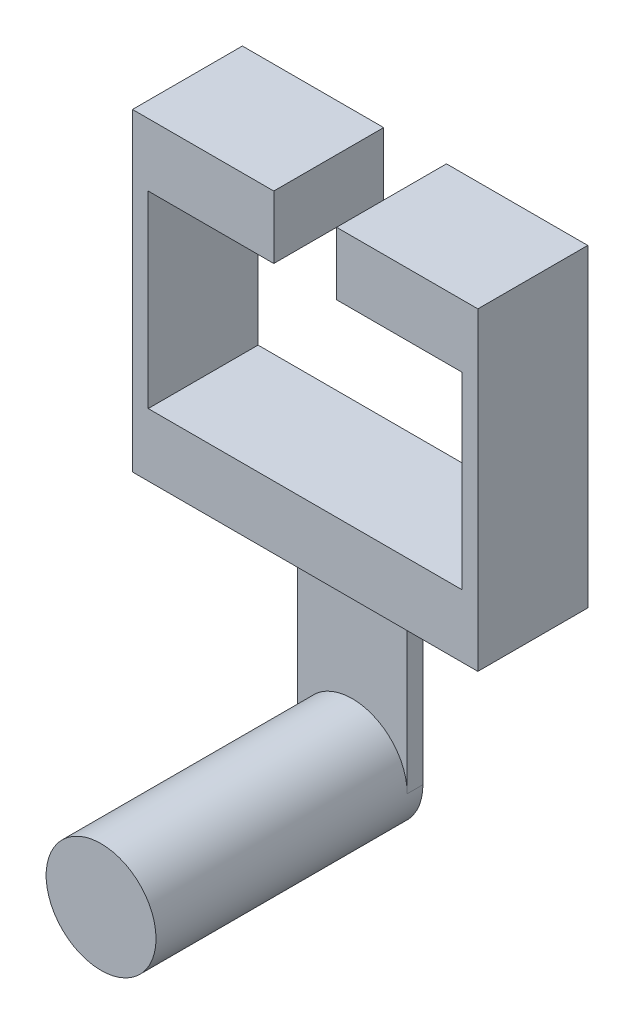
ISO-10303-21;
HEADER;
FILE_DESCRIPTION(('STEP AP214'),'2;1');
FILE_NAME('part.step','',(''),(''),'','','');
FILE_SCHEMA(('AUTOMOTIVE_DESIGN { 1 0 10303 214 1 1 1 1 }'));
ENDSEC;
DATA;
#1=APPLICATION_CONTEXT('core data for automotive mechanical design processes');
#2=APPLICATION_PROTOCOL_DEFINITION('international standard','automotive_design',2000,#1);
#3=PRODUCT_CONTEXT('',#1,'mechanical');
#4=PRODUCT('Part','Part','',(#3));
#5=PRODUCT_RELATED_PRODUCT_CATEGORY('part','',(#4));
#6=PRODUCT_DEFINITION_FORMATION('','',#4);
#7=PRODUCT_DEFINITION_CONTEXT('part definition',#1,'design');
#8=PRODUCT_DEFINITION('design','',#6,#7);
#9=PRODUCT_DEFINITION_SHAPE('','',#8);
#10=(LENGTH_UNIT() NAMED_UNIT(*) SI_UNIT(.MILLI.,.METRE.));
#11=(NAMED_UNIT(*) PLANE_ANGLE_UNIT() SI_UNIT($,.RADIAN.));
#12=(NAMED_UNIT(*) SI_UNIT($,.STERADIAN.) SOLID_ANGLE_UNIT());
#13=UNCERTAINTY_MEASURE_WITH_UNIT(LENGTH_MEASURE(1.E-05),#10,'distance_accuracy_value','');
#14=(GEOMETRIC_REPRESENTATION_CONTEXT(3) GLOBAL_UNCERTAINTY_ASSIGNED_CONTEXT((#13)) GLOBAL_UNIT_ASSIGNED_CONTEXT((#10,
#11,#12)) REPRESENTATION_CONTEXT('',''));
#15=CARTESIAN_POINT('',(0.,0.,0.));
#16=DIRECTION('',(0.,0.,1.));
#17=DIRECTION('',(1.,0.,0.));
#18=AXIS2_PLACEMENT_3D('',#15,#16,#17);
#19=CARTESIAN_POINT('',(171.905082289812,256.485559068862,875.));
#20=DIRECTION('',(0.,1.,0.));
#21=DIRECTION('',(0.,0.,1.));
#22=AXIS2_PLACEMENT_3D('',#19,#20,#21);
#23=PLANE('',#22);
#24=DIRECTION('',(1.,0.,0.));
#25=VECTOR('',#24,1.);
#26=CARTESIAN_POINT('',(171.905082289812,256.485559068862,0.));
#27=LINE('',#26,#25);
#28=CARTESIAN_POINT('',(171.905082289812,256.485559068862,0.));
#29=VERTEX_POINT('',#28);
#30=CARTESIAN_POINT('',(2921.90508228981,256.485559068862,0.));
#31=VERTEX_POINT('',#30);
#32=EDGE_CURVE('E172',#29,#31,#27,.T.);
#33=ORIENTED_EDGE('',*,*,#32,.T.);
#34=DIRECTION('',(0.,0.,-1.));
#35=VECTOR('',#34,1.);
#36=CARTESIAN_POINT('',(2921.90508228981,256.485559068862,875.));
#37=LINE('',#36,#35);
#38=CARTESIAN_POINT('',(2921.90508228981,256.485559068862,875.));
#39=VERTEX_POINT('',#38);
#40=EDGE_CURVE('E11',#39,#31,#37,.T.);
#41=ORIENTED_EDGE('',*,*,#40,.F.);
#42=DIRECTION('',(1.,0.,0.));
#43=VECTOR('',#42,1.);
#44=CARTESIAN_POINT('',(171.905082289812,256.485559068862,875.));
#45=LINE('',#44,#43);
#46=CARTESIAN_POINT('',(171.905082289812,256.485559068862,875.));
#47=VERTEX_POINT('',#46);
#48=EDGE_CURVE('E176',#47,#39,#45,.T.);
#49=ORIENTED_EDGE('',*,*,#48,.F.);
#50=DIRECTION('',(0.,0.,-1.));
#51=VECTOR('',#50,1.);
#52=CARTESIAN_POINT('',(171.905082289812,256.485559068862,875.));
#53=LINE('',#52,#51);
#54=EDGE_CURVE('E206',#47,#29,#53,.T.);
#55=ORIENTED_EDGE('',*,*,#54,.T.);
#56=EDGE_LOOP('',(#33,#41,#49,#55));
#57=FACE_BOUND('',#56,.T.);
#58=DIRECTION('',(0.,0.,-1.));
#59=VECTOR('',#58,1.);
#60=CARTESIAN_POINT('',(1109.40508228981,256.485559068862,375.));
#61=LINE('',#60,#59);
#62=CARTESIAN_POINT('',(1109.40508228981,256.485559068862,500.));
#63=VERTEX_POINT('',#62);
#64=CARTESIAN_POINT('',(1109.40508228981,256.485559068862,375.));
#65=VERTEX_POINT('',#64);
#66=EDGE_CURVE('E52',#63,#65,#61,.T.);
#67=ORIENTED_EDGE('',*,*,#66,.F.);
#68=DIRECTION('',(-1.,0.,0.));
#69=VECTOR('',#68,1.);
#70=CARTESIAN_POINT('',(1109.40508228981,256.485559068862,500.));
#71=LINE('',#70,#69);
#72=CARTESIAN_POINT('',(1984.40508228981,256.485559068862,500.));
#73=VERTEX_POINT('',#72);
#74=EDGE_CURVE('E60',#73,#63,#71,.T.);
#75=ORIENTED_EDGE('',*,*,#74,.F.);
#76=DIRECTION('',(0.,0.,1.));
#77=VECTOR('',#76,1.);
#78=CARTESIAN_POINT('',(1984.40508228981,256.485559068862,500.));
#79=LINE('',#78,#77);
#80=CARTESIAN_POINT('',(1984.40508228981,256.485559068862,375.));
#81=VERTEX_POINT('',#80);
#82=EDGE_CURVE('E488',#81,#73,#79,.T.);
#83=ORIENTED_EDGE('',*,*,#82,.F.);
#84=DIRECTION('',(1.,0.,0.));
#85=VECTOR('',#84,1.);
#86=CARTESIAN_POINT('',(1984.40508228981,256.485559068862,375.));
#87=LINE('',#86,#85);
#88=EDGE_CURVE('E481',#65,#81,#87,.T.);
#89=ORIENTED_EDGE('',*,*,#88,.F.);
#90=EDGE_LOOP('',(#67,#75,#83,#89));
#91=FACE_BOUND('',#90,.T.);
#92=ADVANCED_FACE('F39',(#57,#91),#23,.F.);
#93=CARTESIAN_POINT('',(2921.90508228981,256.485559068862,875.));
#94=DIRECTION('',(-1.,0.,0.));
#95=DIRECTION('',(0.,0.,1.));
#96=AXIS2_PLACEMENT_3D('',#93,#94,#95);
#97=PLANE('',#96);
#98=DIRECTION('',(0.,1.,0.));
#99=VECTOR('',#98,1.);
#100=CARTESIAN_POINT('',(2921.90508228981,256.485559068862,0.));
#101=LINE('',#100,#99);
#102=CARTESIAN_POINT('',(2921.90508228981,2756.48555906886,0.));
#103=VERTEX_POINT('',#102);
#104=EDGE_CURVE('E171',#31,#103,#101,.T.);
#105=ORIENTED_EDGE('',*,*,#104,.T.);
#106=DIRECTION('',(0.,0.,-1.));
#107=VECTOR('',#106,1.);
#108=CARTESIAN_POINT('',(2921.90508228981,2756.48555906886,875.));
#109=LINE('',#108,#107);
#110=CARTESIAN_POINT('',(2921.90508228981,2756.48555906886,875.));
#111=VERTEX_POINT('',#110);
#112=EDGE_CURVE('E46',#111,#103,#109,.T.);
#113=ORIENTED_EDGE('',*,*,#112,.F.);
#114=DIRECTION('',(0.,1.,0.));
#115=VECTOR('',#114,1.);
#116=CARTESIAN_POINT('',(2921.90508228981,256.485559068862,875.));
#117=LINE('',#116,#115);
#118=EDGE_CURVE('E181',#39,#111,#117,.T.);
#119=ORIENTED_EDGE('',*,*,#118,.F.);
#120=ORIENTED_EDGE('',*,*,#40,.T.);
#121=EDGE_LOOP('',(#105,#113,#119,#120));
#122=FACE_BOUND('',#121,.T.);
#123=ADVANCED_FACE('F283',(#122),#97,.F.);
#124=CARTESIAN_POINT('',(2921.90508228981,2756.48555906886,875.));
#125=DIRECTION('',(0.,-1.,0.));
#126=DIRECTION('',(0.,0.,-1.));
#127=AXIS2_PLACEMENT_3D('',#124,#125,#126);
#128=PLANE('',#127);
#129=DIRECTION('',(-1.,0.,0.));
#130=VECTOR('',#129,1.);
#131=CARTESIAN_POINT('',(2921.90508228981,2756.48555906886,0.));
#132=LINE('',#131,#130);
#133=CARTESIAN_POINT('',(1796.90508228981,2756.48555906886,0.));
#134=VERTEX_POINT('',#133);
#135=EDGE_CURVE('E207',#103,#134,#132,.T.);
#136=ORIENTED_EDGE('',*,*,#135,.T.);
#137=DIRECTION('',(0.,0.,-1.));
#138=VECTOR('',#137,1.);
#139=CARTESIAN_POINT('',(1796.90508228981,2756.48555906886,875.));
#140=LINE('',#139,#138);
#141=CARTESIAN_POINT('',(1796.90508228981,2756.48555906886,875.));
#142=VERTEX_POINT('',#141);
#143=EDGE_CURVE('E255',#142,#134,#140,.T.);
#144=ORIENTED_EDGE('',*,*,#143,.F.);
#145=DIRECTION('',(-1.,0.,0.));
#146=VECTOR('',#145,1.);
#147=CARTESIAN_POINT('',(2921.90508228981,2756.48555906886,875.));
#148=LINE('',#147,#146);
#149=EDGE_CURVE('E187',#111,#142,#148,.T.);
#150=ORIENTED_EDGE('',*,*,#149,.F.);
#151=ORIENTED_EDGE('',*,*,#112,.T.);
#152=EDGE_LOOP('',(#136,#144,#150,#151));
#153=FACE_BOUND('',#152,.T.);
#154=ADVANCED_FACE('F261',(#153),#128,.F.);
#155=CARTESIAN_POINT('',(1796.90508228981,2756.48555906886,875.));
#156=DIRECTION('',(1.,0.,0.));
#157=DIRECTION('',(0.,0.,-1.));
#158=AXIS2_PLACEMENT_3D('',#155,#156,#157);
#159=PLANE('',#158);
#160=DIRECTION('',(0.,-1.,0.));
#161=VECTOR('',#160,1.);
#162=CARTESIAN_POINT('',(1796.90508228981,2756.48555906886,0.));
#163=LINE('',#162,#161);
#164=CARTESIAN_POINT('',(1796.90508228981,2256.48555906886,0.));
#165=VERTEX_POINT('',#164);
#166=EDGE_CURVE('E211',#134,#165,#163,.T.);
#167=ORIENTED_EDGE('',*,*,#166,.T.);
#168=DIRECTION('',(0.,0.,-1.));
#169=VECTOR('',#168,1.);
#170=CARTESIAN_POINT('',(1796.90508228981,2256.48555906886,875.));
#171=LINE('',#170,#169);
#172=CARTESIAN_POINT('',(1796.90508228981,2256.48555906886,875.));
#173=VERTEX_POINT('',#172);
#174=EDGE_CURVE('E253',#173,#165,#171,.T.);
#175=ORIENTED_EDGE('',*,*,#174,.F.);
#176=DIRECTION('',(0.,-1.,0.));
#177=VECTOR('',#176,1.);
#178=CARTESIAN_POINT('',(1796.90508228981,2756.48555906886,875.));
#179=LINE('',#178,#177);
#180=EDGE_CURVE('E189',#142,#173,#179,.T.);
#181=ORIENTED_EDGE('',*,*,#180,.F.);
#182=ORIENTED_EDGE('',*,*,#143,.T.);
#183=EDGE_LOOP('',(#167,#175,#181,#182));
#184=FACE_BOUND('',#183,.T.);
#185=ADVANCED_FACE('F275',(#184),#159,.F.);
#186=CARTESIAN_POINT('',(1796.90508228981,2256.48555906886,875.));
#187=DIRECTION('',(0.,1.,0.));
#188=DIRECTION('',(0.,0.,1.));
#189=AXIS2_PLACEMENT_3D('',#186,#187,#188);
#190=PLANE('',#189);
#191=DIRECTION('',(1.,0.,0.));
#192=VECTOR('',#191,1.);
#193=CARTESIAN_POINT('',(1796.90508228981,2256.48555906886,0.));
#194=LINE('',#193,#192);
#195=CARTESIAN_POINT('',(2796.90508228981,2256.48555906886,0.));
#196=VERTEX_POINT('',#195);
#197=EDGE_CURVE('E213',#165,#196,#194,.T.);
#198=ORIENTED_EDGE('',*,*,#197,.T.);
#199=DIRECTION('',(0.,0.,-1.));
#200=VECTOR('',#199,1.);
#201=CARTESIAN_POINT('',(2796.90508228981,2256.48555906886,875.));
#202=LINE('',#201,#200);
#203=CARTESIAN_POINT('',(2796.90508228981,2256.48555906886,875.));
#204=VERTEX_POINT('',#203);
#205=EDGE_CURVE('E247',#204,#196,#202,.T.);
#206=ORIENTED_EDGE('',*,*,#205,.F.);
#207=DIRECTION('',(1.,0.,0.));
#208=VECTOR('',#207,1.);
#209=CARTESIAN_POINT('',(1796.90508228981,2256.48555906886,875.));
#210=LINE('',#209,#208);
#211=EDGE_CURVE('E188',#173,#204,#210,.T.);
#212=ORIENTED_EDGE('',*,*,#211,.F.);
#213=ORIENTED_EDGE('',*,*,#174,.T.);
#214=EDGE_LOOP('',(#198,#206,#212,#213));
#215=FACE_BOUND('',#214,.T.);
#216=ADVANCED_FACE('F277',(#215),#190,.F.);
#217=CARTESIAN_POINT('',(2796.90508228981,2256.48555906886,875.));
#218=DIRECTION('',(1.,0.,0.));
#219=DIRECTION('',(0.,0.,-1.));
#220=AXIS2_PLACEMENT_3D('',#217,#218,#219);
#221=PLANE('',#220);
#222=DIRECTION('',(0.,-1.,0.));
#223=VECTOR('',#222,1.);
#224=CARTESIAN_POINT('',(2796.90508228981,2256.48555906886,0.));
#225=LINE('',#224,#223);
#226=CARTESIAN_POINT('',(2796.90508228981,756.485559068861,0.));
#227=VERTEX_POINT('',#226);
#228=EDGE_CURVE('E214',#196,#227,#225,.T.);
#229=ORIENTED_EDGE('',*,*,#228,.T.);
#230=DIRECTION('',(0.,0.,-1.));
#231=VECTOR('',#230,1.);
#232=CARTESIAN_POINT('',(2796.90508228981,756.485559068861,875.));
#233=LINE('',#232,#231);
#234=CARTESIAN_POINT('',(2796.90508228981,756.485559068861,875.));
#235=VERTEX_POINT('',#234);
#236=EDGE_CURVE('E243',#235,#227,#233,.T.);
#237=ORIENTED_EDGE('',*,*,#236,.F.);
#238=DIRECTION('',(0.,-1.,0.));
#239=VECTOR('',#238,1.);
#240=CARTESIAN_POINT('',(2796.90508228981,2256.48555906886,875.));
#241=LINE('',#240,#239);
#242=EDGE_CURVE('E194',#204,#235,#241,.T.);
#243=ORIENTED_EDGE('',*,*,#242,.F.);
#244=ORIENTED_EDGE('',*,*,#205,.T.);
#245=EDGE_LOOP('',(#229,#237,#243,#244));
#246=FACE_BOUND('',#245,.T.);
#247=ADVANCED_FACE('F316',(#246),#221,.F.);
#248=CARTESIAN_POINT('',(2796.90508228981,756.485559068861,875.));
#249=DIRECTION('',(0.,-1.,0.));
#250=DIRECTION('',(1.,0.,0.));
#251=AXIS2_PLACEMENT_3D('',#248,#249,#250);
#252=PLANE('',#251);
#253=DIRECTION('',(-1.,0.,0.));
#254=VECTOR('',#253,1.);
#255=CARTESIAN_POINT('',(2796.90508228981,756.485559068861,0.));
#256=LINE('',#255,#254);
#257=CARTESIAN_POINT('',(296.905082289812,756.485559068861,0.));
#258=VERTEX_POINT('',#257);
#259=EDGE_CURVE('E220',#227,#258,#256,.T.);
#260=ORIENTED_EDGE('',*,*,#259,.T.);
#261=DIRECTION('',(0.,0.,-1.));
#262=VECTOR('',#261,1.);
#263=CARTESIAN_POINT('',(296.905082289812,756.485559068861,875.));
#264=LINE('',#263,#262);
#265=CARTESIAN_POINT('',(296.905082289812,756.485559068861,875.));
#266=VERTEX_POINT('',#265);
#267=EDGE_CURVE('E245',#266,#258,#264,.T.);
#268=ORIENTED_EDGE('',*,*,#267,.F.);
#269=DIRECTION('',(-1.,0.,0.));
#270=VECTOR('',#269,1.);
#271=CARTESIAN_POINT('',(2796.90508228981,756.485559068861,875.));
#272=LINE('',#271,#270);
#273=EDGE_CURVE('E195',#235,#266,#272,.T.);
#274=ORIENTED_EDGE('',*,*,#273,.F.);
#275=ORIENTED_EDGE('',*,*,#236,.T.);
#276=EDGE_LOOP('',(#260,#268,#274,#275));
#277=FACE_BOUND('',#276,.T.);
#278=ADVANCED_FACE('F311',(#277),#252,.F.);
#279=CARTESIAN_POINT('',(296.905082289812,756.485559068861,875.));
#280=DIRECTION('',(-1.,0.,0.));
#281=DIRECTION('',(0.,0.,1.));
#282=AXIS2_PLACEMENT_3D('',#279,#280,#281);
#283=PLANE('',#282);
#284=DIRECTION('',(0.,1.,0.));
#285=VECTOR('',#284,1.);
#286=CARTESIAN_POINT('',(296.905082289812,756.485559068861,0.));
#287=LINE('',#286,#285);
#288=CARTESIAN_POINT('',(296.905082289812,2256.48555906886,0.));
#289=VERTEX_POINT('',#288);
#290=EDGE_CURVE('E218',#258,#289,#287,.T.);
#291=ORIENTED_EDGE('',*,*,#290,.T.);
#292=DIRECTION('',(0.,0.,-1.));
#293=VECTOR('',#292,1.);
#294=CARTESIAN_POINT('',(296.905082289812,2256.48555906886,875.));
#295=LINE('',#294,#293);
#296=CARTESIAN_POINT('',(296.905082289812,2256.48555906886,875.));
#297=VERTEX_POINT('',#296);
#298=EDGE_CURVE('E239',#297,#289,#295,.T.);
#299=ORIENTED_EDGE('',*,*,#298,.F.);
#300=DIRECTION('',(0.,1.,0.));
#301=VECTOR('',#300,1.);
#302=CARTESIAN_POINT('',(296.905082289812,756.485559068861,875.));
#303=LINE('',#302,#301);
#304=EDGE_CURVE('E198',#266,#297,#303,.T.);
#305=ORIENTED_EDGE('',*,*,#304,.F.);
#306=ORIENTED_EDGE('',*,*,#267,.T.);
#307=EDGE_LOOP('',(#291,#299,#305,#306));
#308=FACE_BOUND('',#307,.T.);
#309=ADVANCED_FACE('F310',(#308),#283,.F.);
#310=CARTESIAN_POINT('',(296.905082289812,2256.48555906886,875.));
#311=DIRECTION('',(0.,1.,0.));
#312=DIRECTION('',(0.,0.,1.));
#313=AXIS2_PLACEMENT_3D('',#310,#311,#312);
#314=PLANE('',#313);
#315=DIRECTION('',(1.,0.,0.));
#316=VECTOR('',#315,1.);
#317=CARTESIAN_POINT('',(296.905082289812,2256.48555906886,0.));
#318=LINE('',#317,#316);
#319=CARTESIAN_POINT('',(1296.90508228981,2256.48555906886,0.));
#320=VERTEX_POINT('',#319);
#321=EDGE_CURVE('E222',#289,#320,#318,.T.);
#322=ORIENTED_EDGE('',*,*,#321,.T.);
#323=DIRECTION('',(0.,0.,-1.));
#324=VECTOR('',#323,1.);
#325=CARTESIAN_POINT('',(1296.90508228981,2256.48555906886,875.));
#326=LINE('',#325,#324);
#327=CARTESIAN_POINT('',(1296.90508228981,2256.48555906886,875.));
#328=VERTEX_POINT('',#327);
#329=EDGE_CURVE('E237',#328,#320,#326,.T.);
#330=ORIENTED_EDGE('',*,*,#329,.F.);
#331=DIRECTION('',(1.,0.,0.));
#332=VECTOR('',#331,1.);
#333=CARTESIAN_POINT('',(296.905082289812,2256.48555906886,875.));
#334=LINE('',#333,#332);
#335=EDGE_CURVE('E196',#297,#328,#334,.T.);
#336=ORIENTED_EDGE('',*,*,#335,.F.);
#337=ORIENTED_EDGE('',*,*,#298,.T.);
#338=EDGE_LOOP('',(#322,#330,#336,#337));
#339=FACE_BOUND('',#338,.T.);
#340=ADVANCED_FACE('F301',(#339),#314,.F.);
#341=CARTESIAN_POINT('',(1296.90508228981,2256.48555906886,875.));
#342=DIRECTION('',(-1.,0.,0.));
#343=DIRECTION('',(0.,0.,1.));
#344=AXIS2_PLACEMENT_3D('',#341,#342,#343);
#345=PLANE('',#344);
#346=DIRECTION('',(0.,1.,0.));
#347=VECTOR('',#346,1.);
#348=CARTESIAN_POINT('',(1296.90508228981,2256.48555906886,0.));
#349=LINE('',#348,#347);
#350=CARTESIAN_POINT('',(1296.90508228981,2756.48555906886,0.));
#351=VERTEX_POINT('',#350);
#352=EDGE_CURVE('E224',#320,#351,#349,.T.);
#353=ORIENTED_EDGE('',*,*,#352,.T.);
#354=DIRECTION('',(0.,0.,-1.));
#355=VECTOR('',#354,1.);
#356=CARTESIAN_POINT('',(1296.90508228981,2756.48555906886,875.));
#357=LINE('',#356,#355);
#358=CARTESIAN_POINT('',(1296.90508228981,2756.48555906886,875.));
#359=VERTEX_POINT('',#358);
#360=EDGE_CURVE('E232',#359,#351,#357,.T.);
#361=ORIENTED_EDGE('',*,*,#360,.F.);
#362=DIRECTION('',(0.,1.,0.));
#363=VECTOR('',#362,1.);
#364=CARTESIAN_POINT('',(1296.90508228981,2256.48555906886,875.));
#365=LINE('',#364,#363);
#366=EDGE_CURVE('E199',#328,#359,#365,.T.);
#367=ORIENTED_EDGE('',*,*,#366,.F.);
#368=ORIENTED_EDGE('',*,*,#329,.T.);
#369=EDGE_LOOP('',(#353,#361,#367,#368));
#370=FACE_BOUND('',#369,.T.);
#371=ADVANCED_FACE('F298',(#370),#345,.F.);
#372=CARTESIAN_POINT('',(1296.90508228981,2756.48555906886,875.));
#373=DIRECTION('',(0.,-1.,0.));
#374=DIRECTION('',(0.,0.,-1.));
#375=AXIS2_PLACEMENT_3D('',#372,#373,#374);
#376=PLANE('',#375);
#377=DIRECTION('',(-1.,0.,0.));
#378=VECTOR('',#377,1.);
#379=CARTESIAN_POINT('',(1296.90508228981,2756.48555906886,0.));
#380=LINE('',#379,#378);
#381=CARTESIAN_POINT('',(171.905082289812,2756.48555906886,0.));
#382=VERTEX_POINT('',#381);
#383=EDGE_CURVE('E223',#351,#382,#380,.T.);
#384=ORIENTED_EDGE('',*,*,#383,.T.);
#385=DIRECTION('',(0.,0.,-1.));
#386=VECTOR('',#385,1.);
#387=CARTESIAN_POINT('',(171.905082289812,2756.48555906886,875.));
#388=LINE('',#387,#386);
#389=CARTESIAN_POINT('',(171.905082289812,2756.48555906886,875.));
#390=VERTEX_POINT('',#389);
#391=EDGE_CURVE('E233',#390,#382,#388,.T.);
#392=ORIENTED_EDGE('',*,*,#391,.F.);
#393=DIRECTION('',(-1.,0.,0.));
#394=VECTOR('',#393,1.);
#395=CARTESIAN_POINT('',(1296.90508228981,2756.48555906886,875.));
#396=LINE('',#395,#394);
#397=EDGE_CURVE('E205',#359,#390,#396,.T.);
#398=ORIENTED_EDGE('',*,*,#397,.F.);
#399=ORIENTED_EDGE('',*,*,#360,.T.);
#400=EDGE_LOOP('',(#384,#392,#398,#399));
#401=FACE_BOUND('',#400,.T.);
#402=ADVANCED_FACE('F294',(#401),#376,.F.);
#403=CARTESIAN_POINT('',(171.905082289812,256.485559068862,875.));
#404=DIRECTION('',(-1.,0.,0.));
#405=DIRECTION('',(0.,0.,1.));
#406=AXIS2_PLACEMENT_3D('',#403,#404,#405);
#407=PLANE('',#406);
#408=DIRECTION('',(0.,1.,0.));
#409=VECTOR('',#408,1.);
#410=CARTESIAN_POINT('',(171.905082289812,256.485559068862,0.));
#411=LINE('',#410,#409);
#412=EDGE_CURVE('E184',#29,#382,#411,.T.);
#413=ORIENTED_EDGE('',*,*,#412,.F.);
#414=ORIENTED_EDGE('',*,*,#54,.F.);
#415=DIRECTION('',(0.,1.,0.));
#416=VECTOR('',#415,1.);
#417=CARTESIAN_POINT('',(171.905082289812,256.485559068862,875.));
#418=LINE('',#417,#416);
#419=EDGE_CURVE('E204',#47,#390,#418,.T.);
#420=ORIENTED_EDGE('',*,*,#419,.T.);
#421=ORIENTED_EDGE('',*,*,#391,.T.);
#422=EDGE_LOOP('',(#413,#414,#420,#421));
#423=FACE_BOUND('',#422,.T.);
#424=ADVANCED_FACE('F286',(#423),#407,.T.);
#425=CARTESIAN_POINT('',(0.,0.,875.));
#426=DIRECTION('',(0.,0.,1.));
#427=DIRECTION('',(1.,0.,0.));
#428=AXIS2_PLACEMENT_3D('',#425,#426,#427);
#429=PLANE('',#428);
#430=ORIENTED_EDGE('',*,*,#48,.T.);
#431=ORIENTED_EDGE('',*,*,#118,.T.);
#432=ORIENTED_EDGE('',*,*,#149,.T.);
#433=ORIENTED_EDGE('',*,*,#180,.T.);
#434=ORIENTED_EDGE('',*,*,#211,.T.);
#435=ORIENTED_EDGE('',*,*,#242,.T.);
#436=ORIENTED_EDGE('',*,*,#273,.T.);
#437=ORIENTED_EDGE('',*,*,#304,.T.);
#438=ORIENTED_EDGE('',*,*,#335,.T.);
#439=ORIENTED_EDGE('',*,*,#366,.T.);
#440=ORIENTED_EDGE('',*,*,#397,.T.);
#441=ORIENTED_EDGE('',*,*,#419,.F.);
#442=EDGE_LOOP('',(#430,#431,#432,#433,#434,#435,#436,#437,#438,#439,#440,#441));
#443=FACE_BOUND('',#442,.T.);
#444=ADVANCED_FACE('F278',(#443),#429,.T.);
#445=CARTESIAN_POINT('',(0.,0.,0.));
#446=DIRECTION('',(0.,0.,1.));
#447=DIRECTION('',(1.,0.,0.));
#448=AXIS2_PLACEMENT_3D('',#445,#446,#447);
#449=PLANE('',#448);
#450=ORIENTED_EDGE('',*,*,#32,.F.);
#451=ORIENTED_EDGE('',*,*,#412,.T.);
#452=ORIENTED_EDGE('',*,*,#383,.F.);
#453=ORIENTED_EDGE('',*,*,#352,.F.);
#454=ORIENTED_EDGE('',*,*,#321,.F.);
#455=ORIENTED_EDGE('',*,*,#290,.F.);
#456=ORIENTED_EDGE('',*,*,#259,.F.);
#457=ORIENTED_EDGE('',*,*,#228,.F.);
#458=ORIENTED_EDGE('',*,*,#197,.F.);
#459=ORIENTED_EDGE('',*,*,#166,.F.);
#460=ORIENTED_EDGE('',*,*,#135,.F.);
#461=ORIENTED_EDGE('',*,*,#104,.F.);
#462=EDGE_LOOP('',(#450,#451,#452,#453,#454,#455,#456,#457,#458,#459,#460,#461));
#463=FACE_BOUND('',#462,.T.);
#464=ADVANCED_FACE('F270',(#463),#449,.F.);
#465=CARTESIAN_POINT('',(1109.40508228981,-1243.51444093114,375.));
#466=DIRECTION('',(1.,0.,0.));
#467=DIRECTION('',(0.,0.,-1.));
#468=AXIS2_PLACEMENT_3D('',#465,#466,#467);
#469=PLANE('',#468);
#470=ORIENTED_EDGE('',*,*,#66,.T.);
#471=DIRECTION('',(0.,1.,0.));
#472=VECTOR('',#471,1.);
#473=CARTESIAN_POINT('',(1109.40508228981,-1243.51444093114,375.));
#474=LINE('',#473,#472);
#475=CARTESIAN_POINT('',(1109.40508228981,-1243.51444093114,375.));
#476=VERTEX_POINT('',#475);
#477=EDGE_CURVE('E152',#476,#65,#474,.T.);
#478=ORIENTED_EDGE('',*,*,#477,.F.);
#479=DIRECTION('',(0.,0.,-1.));
#480=VECTOR('',#479,1.);
#481=CARTESIAN_POINT('',(1109.40508228981,-1243.51444093114,375.));
#482=LINE('',#481,#480);
#483=CARTESIAN_POINT('',(1109.40508228981,-1243.51444093114,500.));
#484=VERTEX_POINT('',#483);
#485=EDGE_CURVE('E165',#484,#476,#482,.T.);
#486=ORIENTED_EDGE('',*,*,#485,.F.);
#487=DIRECTION('',(0.,1.,0.));
#488=VECTOR('',#487,1.);
#489=CARTESIAN_POINT('',(1109.40508228981,-1243.51444093114,500.));
#490=LINE('',#489,#488);
#491=EDGE_CURVE('E484',#484,#63,#490,.T.);
#492=ORIENTED_EDGE('',*,*,#491,.T.);
#493=EDGE_LOOP('',(#470,#478,#486,#492));
#494=FACE_BOUND('',#493,.T.);
#495=ADVANCED_FACE('F168',(#494),#469,.F.);
#496=CARTESIAN_POINT('',(1984.40508228981,-1243.51444093114,375.));
#497=DIRECTION('',(0.,0.,1.));
#498=DIRECTION('',(1.,0.,0.));
#499=AXIS2_PLACEMENT_3D('',#496,#497,#498);
#500=PLANE('',#499);
#501=ORIENTED_EDGE('',*,*,#88,.T.);
#502=DIRECTION('',(0.,1.,0.));
#503=VECTOR('',#502,1.);
#504=CARTESIAN_POINT('',(1984.40508228981,-1243.51444093114,375.));
#505=LINE('',#504,#503);
#506=CARTESIAN_POINT('',(1984.40508228981,-1243.51444093114,375.));
#507=VERTEX_POINT('',#506);
#508=EDGE_CURVE('E156',#507,#81,#505,.T.);
#509=ORIENTED_EDGE('',*,*,#508,.F.);
#510=CARTESIAN_POINT('',(1546.90508228981,-1243.51444093114,375.));
#511=DIRECTION('',(0.,0.,-1.));
#512=DIRECTION('',(-1.,0.,0.));
#513=AXIS2_PLACEMENT_3D('',#510,#511,#512);
#514=CIRCLE('',#513,437.5);
#515=EDGE_CURVE('E149',#507,#476,#514,.T.);
#516=ORIENTED_EDGE('',*,*,#515,.T.);
#517=ORIENTED_EDGE('',*,*,#477,.T.);
#518=EDGE_LOOP('',(#501,#509,#516,#517));
#519=FACE_BOUND('',#518,.T.);
#520=ADVANCED_FACE('F155',(#519),#500,.F.);
#521=CARTESIAN_POINT('',(1984.40508228981,-1243.51444093114,500.));
#522=DIRECTION('',(-1.,0.,0.));
#523=DIRECTION('',(0.,0.,1.));
#524=AXIS2_PLACEMENT_3D('',#521,#522,#523);
#525=PLANE('',#524);
#526=ORIENTED_EDGE('',*,*,#82,.T.);
#527=DIRECTION('',(0.,1.,0.));
#528=VECTOR('',#527,1.);
#529=CARTESIAN_POINT('',(1984.40508228981,-1243.51444093114,500.));
#530=LINE('',#529,#528);
#531=CARTESIAN_POINT('',(1984.40508228981,-1243.51444093114,500.));
#532=VERTEX_POINT('',#531);
#533=EDGE_CURVE('E178',#532,#73,#530,.T.);
#534=ORIENTED_EDGE('',*,*,#533,.F.);
#535=DIRECTION('',(0.,0.,1.));
#536=VECTOR('',#535,1.);
#537=CARTESIAN_POINT('',(1984.40508228981,-1243.51444093114,500.));
#538=LINE('',#537,#536);
#539=EDGE_CURVE('E169',#507,#532,#538,.T.);
#540=ORIENTED_EDGE('',*,*,#539,.F.);
#541=ORIENTED_EDGE('',*,*,#508,.T.);
#542=EDGE_LOOP('',(#526,#534,#540,#541));
#543=FACE_BOUND('',#542,.T.);
#544=ADVANCED_FACE('F432',(#543),#525,.F.);
#545=CARTESIAN_POINT('',(1109.40508228981,-1243.51444093114,500.));
#546=DIRECTION('',(0.,0.,-1.));
#547=DIRECTION('',(-1.,0.,0.));
#548=AXIS2_PLACEMENT_3D('',#545,#546,#547);
#549=PLANE('',#548);
#550=CARTESIAN_POINT('',(1546.90508228981,-1243.51444093114,500.));
#551=DIRECTION('',(0.,0.,1.));
#552=DIRECTION('',(1.,0.,0.));
#553=AXIS2_PLACEMENT_3D('',#550,#551,#552);
#554=CIRCLE('',#553,437.5);
#555=EDGE_CURVE('E157',#532,#484,#554,.T.);
#556=ORIENTED_EDGE('',*,*,#555,.F.);
#557=ORIENTED_EDGE('',*,*,#533,.T.);
#558=ORIENTED_EDGE('',*,*,#74,.T.);
#559=ORIENTED_EDGE('',*,*,#491,.F.);
#560=EDGE_LOOP('',(#556,#557,#558,#559));
#561=FACE_BOUND('',#560,.T.);
#562=ADVANCED_FACE('F447',(#561),#549,.F.);
#563=CARTESIAN_POINT('',(1546.90508228981,-1243.51444093114,2500.));
#564=DIRECTION('',(0.,0.,-1.));
#565=DIRECTION('',(-1.,0.,0.));
#566=AXIS2_PLACEMENT_3D('',#563,#564,#565);
#567=CYLINDRICAL_SURFACE('',#566,437.5);
#568=CARTESIAN_POINT('',(1546.90508228981,-1243.51444093114,2500.));
#569=DIRECTION('',(0.,0.,1.));
#570=DIRECTION('',(1.,0.,0.));
#571=AXIS2_PLACEMENT_3D('',#568,#569,#570);
#572=CIRCLE('',#571,437.5);
#573=CARTESIAN_POINT('',(1984.40508228981,-1243.51444093114,2500.));
#574=VERTEX_POINT('',#573);
#575=EDGE_CURVE('E479',#574,#574,#572,.T.);
#576=ORIENTED_EDGE('',*,*,#575,.F.);
#577=EDGE_LOOP('',(#576));
#578=FACE_BOUND('',#577,.T.);
#579=ORIENTED_EDGE('',*,*,#555,.T.);
#580=ORIENTED_EDGE('',*,*,#485,.T.);
#581=ORIENTED_EDGE('',*,*,#515,.F.);
#582=ORIENTED_EDGE('',*,*,#539,.T.);
#583=EDGE_LOOP('',(#579,#580,#581,#582));
#584=FACE_BOUND('',#583,.T.);
#585=ADVANCED_FACE('F162',(#578,#584),#567,.T.);
#586=CARTESIAN_POINT('',(1546.90508228981,-1243.51444093114,2500.));
#587=DIRECTION('',(0.,0.,1.));
#588=DIRECTION('',(1.,0.,0.));
#589=AXIS2_PLACEMENT_3D('',#586,#587,#588);
#590=PLANE('',#589);
#591=ORIENTED_EDGE('',*,*,#575,.T.);
#592=EDGE_LOOP('',(#591));
#593=FACE_BOUND('',#592,.T.);
#594=ADVANCED_FACE('F461',(#593),#590,.T.);
#595=CLOSED_SHELL('',(#92,#123,#154,#185,#216,#247,#278,#309,#340,#371,#402,#424,#444,#464,#495,
#520,#544,#562,#585,#594));
#596=MANIFOLD_SOLID_BREP('B2',#595);
#597=ADVANCED_BREP_SHAPE_REPRESENTATION('',(#18,#596),#14);
#598=SHAPE_DEFINITION_REPRESENTATION(#9,#597);
ENDSEC;
END-ISO-10303-21;
